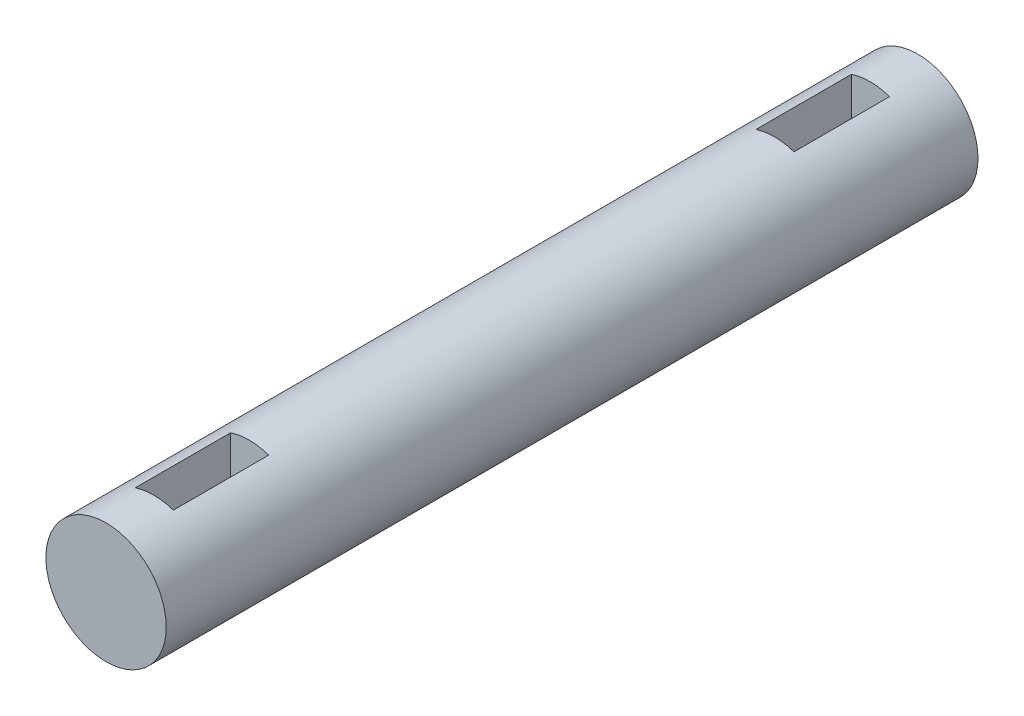
ISO-10303-21;
HEADER;
FILE_DESCRIPTION(('STEP AP214'),'2;1');
FILE_NAME('part.step','',(''),(''),'','','');
FILE_SCHEMA(('AUTOMOTIVE_DESIGN { 1 0 10303 214 1 1 1 1 }'));
ENDSEC;
DATA;
#1=APPLICATION_CONTEXT('core data for automotive mechanical design processes');
#2=APPLICATION_PROTOCOL_DEFINITION('international standard','automotive_design',2000,#1);
#3=PRODUCT_CONTEXT('',#1,'mechanical');
#4=PRODUCT('Part','Part','',(#3));
#5=PRODUCT_RELATED_PRODUCT_CATEGORY('part','',(#4));
#6=PRODUCT_DEFINITION_FORMATION('','',#4);
#7=PRODUCT_DEFINITION_CONTEXT('part definition',#1,'design');
#8=PRODUCT_DEFINITION('design','',#6,#7);
#9=PRODUCT_DEFINITION_SHAPE('','',#8);
#10=(LENGTH_UNIT() NAMED_UNIT(*) SI_UNIT(.MILLI.,.METRE.));
#11=(NAMED_UNIT(*) PLANE_ANGLE_UNIT() SI_UNIT($,.RADIAN.));
#12=(NAMED_UNIT(*) SI_UNIT($,.STERADIAN.) SOLID_ANGLE_UNIT());
#13=UNCERTAINTY_MEASURE_WITH_UNIT(LENGTH_MEASURE(1.E-05),#10,'distance_accuracy_value','');
#14=(GEOMETRIC_REPRESENTATION_CONTEXT(3) GLOBAL_UNCERTAINTY_ASSIGNED_CONTEXT((#13)) GLOBAL_UNIT_ASSIGNED_CONTEXT((#10,
#11,#12)) REPRESENTATION_CONTEXT('',''));
#15=CARTESIAN_POINT('',(0.,0.,0.));
#16=DIRECTION('',(0.,0.,1.));
#17=DIRECTION('',(1.,0.,0.));
#18=AXIS2_PLACEMENT_3D('',#15,#16,#17);
#19=CARTESIAN_POINT('',(0.,0.,-5.));
#20=DIRECTION('',(0.,0.,1.));
#21=DIRECTION('',(1.,0.,0.));
#22=AXIS2_PLACEMENT_3D('',#19,#20,#21);
#23=CYLINDRICAL_SURFACE('',#22,6.3);
#24=CARTESIAN_POINT('',(0.,0.,74.9918981065505));
#25=DIRECTION('',(0.,0.,1.));
#26=DIRECTION('',(1.,0.,0.));
#27=AXIS2_PLACEMENT_3D('',#24,#25,#26);
#28=CIRCLE('',#27,6.3);
#29=CARTESIAN_POINT('',(-1.95516009173228,5.98893554946932,74.9918981065505));
#30=VERTEX_POINT('',#29);
#31=CARTESIAN_POINT('',(2.03835839350811,5.96113202836635,74.9918981065505));
#32=VERTEX_POINT('',#31);
#33=EDGE_CURVE('E11',#30,#32,#28,.F.);
#34=ORIENTED_EDGE('',*,*,#33,.F.);
#35=DIRECTION('',(0.,0.,1.));
#36=VECTOR('',#35,1.);
#37=CARTESIAN_POINT('',(-1.95516009173228,5.98893554946932,-5.));
#38=LINE('',#37,#36);
#39=CARTESIAN_POINT('',(-1.95516009173228,5.98893554946932,65.0081018934496));
#40=VERTEX_POINT('',#39);
#41=EDGE_CURVE('E188',#40,#30,#38,.T.);
#42=ORIENTED_EDGE('',*,*,#41,.F.);
#43=CARTESIAN_POINT('',(0.,0.,65.0081018934496));
#44=DIRECTION('',(0.,0.,-1.));
#45=DIRECTION('',(-1.,0.,0.));
#46=AXIS2_PLACEMENT_3D('',#43,#44,#45);
#47=CIRCLE('',#46,6.3);
#48=CARTESIAN_POINT('',(2.03835839350811,5.96113202836635,65.0081018934496));
#49=VERTEX_POINT('',#48);
#50=EDGE_CURVE('E107',#49,#40,#47,.F.);
#51=ORIENTED_EDGE('',*,*,#50,.F.);
#52=DIRECTION('',(0.,0.,1.));
#53=VECTOR('',#52,1.);
#54=CARTESIAN_POINT('',(2.0383583935081,5.96113202836635,-5.));
#55=LINE('',#54,#53);
#56=EDGE_CURVE('E47',#32,#49,#55,.F.);
#57=ORIENTED_EDGE('',*,*,#56,.F.);
#58=EDGE_LOOP('',(#34,#42,#51,#57));
#59=FACE_BOUND('',#58,.T.);
#60=CARTESIAN_POINT('',(0.,0.,-5.));
#61=DIRECTION('',(0.,0.,1.));
#62=DIRECTION('',(1.,0.,0.));
#63=AXIS2_PLACEMENT_3D('',#60,#61,#62);
#64=CIRCLE('',#63,6.3);
#65=CARTESIAN_POINT('',(6.3,0.,-5.));
#66=VERTEX_POINT('',#65);
#67=EDGE_CURVE('E171',#66,#66,#64,.T.);
#68=ORIENTED_EDGE('',*,*,#67,.T.);
#69=EDGE_LOOP('',(#68));
#70=FACE_BOUND('',#69,.T.);
#71=CARTESIAN_POINT('',(0.,0.,80.));
#72=DIRECTION('',(0.,0.,1.));
#73=DIRECTION('',(1.,0.,0.));
#74=AXIS2_PLACEMENT_3D('',#71,#72,#73);
#75=CIRCLE('',#74,6.3);
#76=CARTESIAN_POINT('',(6.3,0.,80.));
#77=VERTEX_POINT('',#76);
#78=EDGE_CURVE('E141',#77,#77,#75,.T.);
#79=ORIENTED_EDGE('',*,*,#78,.F.);
#80=EDGE_LOOP('',(#79));
#81=FACE_BOUND('',#80,.T.);
#82=CARTESIAN_POINT('',(0.,0.,10.));
#83=DIRECTION('',(0.,0.,1.));
#84=DIRECTION('',(1.,0.,0.));
#85=AXIS2_PLACEMENT_3D('',#82,#83,#84);
#86=CIRCLE('',#85,6.3);
#87=CARTESIAN_POINT('',(-1.95516009173228,5.98893554946932,10.));
#88=VERTEX_POINT('',#87);
#89=CARTESIAN_POINT('',(2.03835839350811,5.96113202836635,10.));
#90=VERTEX_POINT('',#89);
#91=EDGE_CURVE('E181',#88,#90,#86,.F.);
#92=ORIENTED_EDGE('',*,*,#91,.F.);
#93=DIRECTION('',(0.,0.,1.));
#94=VECTOR('',#93,1.);
#95=CARTESIAN_POINT('',(-1.95516009173228,5.98893554946932,-5.));
#96=LINE('',#95,#94);
#97=CARTESIAN_POINT('',(-1.95516009173228,5.98893554946932,0.));
#98=VERTEX_POINT('',#97);
#99=EDGE_CURVE('E184',#88,#98,#96,.F.);
#100=ORIENTED_EDGE('',*,*,#99,.T.);
#101=CARTESIAN_POINT('',(0.,0.,0.));
#102=DIRECTION('',(0.,0.,-1.));
#103=DIRECTION('',(-1.,0.,0.));
#104=AXIS2_PLACEMENT_3D('',#101,#102,#103);
#105=CIRCLE('',#104,6.3);
#106=CARTESIAN_POINT('',(2.03835839350811,5.96113202836635,0.));
#107=VERTEX_POINT('',#106);
#108=EDGE_CURVE('E175',#107,#98,#105,.F.);
#109=ORIENTED_EDGE('',*,*,#108,.F.);
#110=DIRECTION('',(0.,0.,1.));
#111=VECTOR('',#110,1.);
#112=CARTESIAN_POINT('',(2.0383583935081,5.96113202836635,-5.));
#113=LINE('',#112,#111);
#114=EDGE_CURVE('E178',#90,#107,#113,.F.);
#115=ORIENTED_EDGE('',*,*,#114,.F.);
#116=EDGE_LOOP('',(#92,#100,#109,#115));
#117=FACE_BOUND('',#116,.T.);
#118=ADVANCED_FACE('F39',(#59,#70,#81,#117),#23,.T.);
#119=CARTESIAN_POINT('',(0.,0.,-5.));
#120=DIRECTION('',(0.,0.,1.));
#121=DIRECTION('',(1.,0.,0.));
#122=AXIS2_PLACEMENT_3D('',#119,#120,#121);
#123=PLANE('',#122);
#124=ORIENTED_EDGE('',*,*,#67,.F.);
#125=EDGE_LOOP('',(#124));
#126=FACE_BOUND('',#125,.T.);
#127=ADVANCED_FACE('F215',(#126),#123,.F.);
#128=CARTESIAN_POINT('',(0.,0.,80.));
#129=DIRECTION('',(0.,0.,1.));
#130=DIRECTION('',(1.,0.,0.));
#131=AXIS2_PLACEMENT_3D('',#128,#129,#130);
#132=PLANE('',#131);
#133=ORIENTED_EDGE('',*,*,#78,.T.);
#134=EDGE_LOOP('',(#133));
#135=FACE_BOUND('',#134,.T.);
#136=ADVANCED_FACE('F219',(#135),#132,.T.);
#137=CARTESIAN_POINT('',(-1.95516009173228,10.,0.));
#138=DIRECTION('',(1.,0.,0.));
#139=DIRECTION('',(0.,0.,-1.));
#140=AXIS2_PLACEMENT_3D('',#137,#138,#139);
#141=PLANE('',#140);
#142=DIRECTION('',(0.,-1.,0.));
#143=VECTOR('',#142,1.);
#144=CARTESIAN_POINT('',(-1.95516009173228,10.,10.));
#145=LINE('',#144,#143);
#146=CARTESIAN_POINT('',(-1.95516009173228,0.,10.));
#147=VERTEX_POINT('',#146);
#148=EDGE_CURVE('E150',#88,#147,#145,.T.);
#149=ORIENTED_EDGE('',*,*,#148,.T.);
#150=DIRECTION('',(0.,0.,1.));
#151=VECTOR('',#150,1.);
#152=CARTESIAN_POINT('',(-1.95516009173228,0.,0.));
#153=LINE('',#152,#151);
#154=CARTESIAN_POINT('',(-1.95516009173228,0.,0.));
#155=VERTEX_POINT('',#154);
#156=EDGE_CURVE('E128',#155,#147,#153,.T.);
#157=ORIENTED_EDGE('',*,*,#156,.F.);
#158=DIRECTION('',(0.,-1.,0.));
#159=VECTOR('',#158,1.);
#160=CARTESIAN_POINT('',(-1.95516009173228,10.,0.));
#161=LINE('',#160,#159);
#162=EDGE_CURVE('E147',#98,#155,#161,.T.);
#163=ORIENTED_EDGE('',*,*,#162,.F.);
#164=ORIENTED_EDGE('',*,*,#99,.F.);
#165=EDGE_LOOP('',(#149,#157,#163,#164));
#166=FACE_BOUND('',#165,.T.);
#167=ADVANCED_FACE('F224',(#166),#141,.T.);
#168=CARTESIAN_POINT('',(2.03835839350811,10.,10.));
#169=DIRECTION('',(0.,0.,1.));
#170=DIRECTION('',(1.,0.,0.));
#171=AXIS2_PLACEMENT_3D('',#168,#169,#170);
#172=PLANE('',#171);
#173=ORIENTED_EDGE('',*,*,#91,.T.);
#174=DIRECTION('',(0.,-1.,0.));
#175=VECTOR('',#174,1.);
#176=CARTESIAN_POINT('',(2.03835839350811,10.,10.));
#177=LINE('',#176,#175);
#178=CARTESIAN_POINT('',(2.03835839350811,0.,10.));
#179=VERTEX_POINT('',#178);
#180=EDGE_CURVE('E153',#90,#179,#177,.T.);
#181=ORIENTED_EDGE('',*,*,#180,.T.);
#182=DIRECTION('',(-1.,0.,0.));
#183=VECTOR('',#182,1.);
#184=CARTESIAN_POINT('',(2.03835839350811,0.,10.));
#185=LINE('',#184,#183);
#186=EDGE_CURVE('E132',#179,#147,#185,.T.);
#187=ORIENTED_EDGE('',*,*,#186,.T.);
#188=ORIENTED_EDGE('',*,*,#148,.F.);
#189=EDGE_LOOP('',(#173,#181,#187,#188));
#190=FACE_BOUND('',#189,.T.);
#191=ADVANCED_FACE('F234',(#190),#172,.F.);
#192=CARTESIAN_POINT('',(2.03835839350811,10.,0.));
#193=DIRECTION('',(1.,0.,0.));
#194=DIRECTION('',(0.,0.,-1.));
#195=AXIS2_PLACEMENT_3D('',#192,#193,#194);
#196=PLANE('',#195);
#197=ORIENTED_EDGE('',*,*,#114,.T.);
#198=DIRECTION('',(0.,-1.,0.));
#199=VECTOR('',#198,1.);
#200=CARTESIAN_POINT('',(2.03835839350811,10.,0.));
#201=LINE('',#200,#199);
#202=CARTESIAN_POINT('',(2.03835839350811,0.,0.));
#203=VERTEX_POINT('',#202);
#204=EDGE_CURVE('E62',#107,#203,#201,.T.);
#205=ORIENTED_EDGE('',*,*,#204,.T.);
#206=DIRECTION('',(0.,0.,1.));
#207=VECTOR('',#206,1.);
#208=CARTESIAN_POINT('',(2.03835839350811,0.,0.));
#209=LINE('',#208,#207);
#210=EDGE_CURVE('E161',#203,#179,#209,.T.);
#211=ORIENTED_EDGE('',*,*,#210,.T.);
#212=ORIENTED_EDGE('',*,*,#180,.F.);
#213=EDGE_LOOP('',(#197,#205,#211,#212));
#214=FACE_BOUND('',#213,.T.);
#215=ADVANCED_FACE('F231',(#214),#196,.F.);
#216=CARTESIAN_POINT('',(0.,10.,0.));
#217=DIRECTION('',(0.,0.,-1.));
#218=DIRECTION('',(-1.,0.,0.));
#219=AXIS2_PLACEMENT_3D('',#216,#217,#218);
#220=PLANE('',#219);
#221=ORIENTED_EDGE('',*,*,#108,.T.);
#222=ORIENTED_EDGE('',*,*,#162,.T.);
#223=DIRECTION('',(1.,0.,0.));
#224=VECTOR('',#223,1.);
#225=CARTESIAN_POINT('',(0.,0.,0.));
#226=LINE('',#225,#224);
#227=EDGE_CURVE('E158',#155,#203,#226,.T.);
#228=ORIENTED_EDGE('',*,*,#227,.T.);
#229=ORIENTED_EDGE('',*,*,#204,.F.);
#230=EDGE_LOOP('',(#221,#222,#228,#229));
#231=FACE_BOUND('',#230,.T.);
#232=ADVANCED_FACE('F210',(#231),#220,.F.);
#233=CARTESIAN_POINT('',(0.,0.,0.));
#234=DIRECTION('',(0.,1.,0.));
#235=DIRECTION('',(0.,0.,1.));
#236=AXIS2_PLACEMENT_3D('',#233,#234,#235);
#237=PLANE('',#236);
#238=ORIENTED_EDGE('',*,*,#156,.T.);
#239=ORIENTED_EDGE('',*,*,#186,.F.);
#240=ORIENTED_EDGE('',*,*,#210,.F.);
#241=ORIENTED_EDGE('',*,*,#227,.F.);
#242=EDGE_LOOP('',(#238,#239,#240,#241));
#243=FACE_BOUND('',#242,.T.);
#244=ADVANCED_FACE('F203',(#243),#237,.T.);
#245=CARTESIAN_POINT('',(2.03835839350811,10.,74.9918981065505));
#246=DIRECTION('',(0.,0.,1.));
#247=DIRECTION('',(1.,0.,0.));
#248=AXIS2_PLACEMENT_3D('',#245,#246,#247);
#249=PLANE('',#248);
#250=ORIENTED_EDGE('',*,*,#33,.T.);
#251=DIRECTION('',(0.,-1.,0.));
#252=VECTOR('',#251,1.);
#253=CARTESIAN_POINT('',(2.03835839350811,10.,74.9918981065505));
#254=LINE('',#253,#252);
#255=CARTESIAN_POINT('',(2.03835839350811,0.,74.9918981065505));
#256=VERTEX_POINT('',#255);
#257=EDGE_CURVE('E142',#32,#256,#254,.T.);
#258=ORIENTED_EDGE('',*,*,#257,.T.);
#259=DIRECTION('',(-1.,0.,0.));
#260=VECTOR('',#259,1.);
#261=CARTESIAN_POINT('',(2.03835839350811,0.,74.9918981065505));
#262=LINE('',#261,#260);
#263=CARTESIAN_POINT('',(-1.95516009173228,0.,74.9918981065505));
#264=VERTEX_POINT('',#263);
#265=EDGE_CURVE('E111',#256,#264,#262,.T.);
#266=ORIENTED_EDGE('',*,*,#265,.T.);
#267=DIRECTION('',(0.,-1.,0.));
#268=VECTOR('',#267,1.);
#269=CARTESIAN_POINT('',(-1.95516009173228,10.,74.9918981065505));
#270=LINE('',#269,#268);
#271=EDGE_CURVE('E126',#30,#264,#270,.T.);
#272=ORIENTED_EDGE('',*,*,#271,.F.);
#273=EDGE_LOOP('',(#250,#258,#266,#272));
#274=FACE_BOUND('',#273,.T.);
#275=ADVANCED_FACE('F201',(#274),#249,.F.);
#276=CARTESIAN_POINT('',(2.03835839350811,10.,65.0081018934496));
#277=DIRECTION('',(1.,0.,0.));
#278=DIRECTION('',(0.,0.,-1.));
#279=AXIS2_PLACEMENT_3D('',#276,#277,#278);
#280=PLANE('',#279);
#281=ORIENTED_EDGE('',*,*,#56,.T.);
#282=DIRECTION('',(0.,-1.,0.));
#283=VECTOR('',#282,1.);
#284=CARTESIAN_POINT('',(2.03835839350811,10.,65.0081018934496));
#285=LINE('',#284,#283);
#286=CARTESIAN_POINT('',(2.03835839350811,0.,65.0081018934496));
#287=VERTEX_POINT('',#286);
#288=EDGE_CURVE('E110',#49,#287,#285,.T.);
#289=ORIENTED_EDGE('',*,*,#288,.T.);
#290=DIRECTION('',(0.,0.,1.));
#291=VECTOR('',#290,1.);
#292=CARTESIAN_POINT('',(2.03835839350811,0.,65.0081018934496));
#293=LINE('',#292,#291);
#294=EDGE_CURVE('E121',#287,#256,#293,.T.);
#295=ORIENTED_EDGE('',*,*,#294,.T.);
#296=ORIENTED_EDGE('',*,*,#257,.F.);
#297=EDGE_LOOP('',(#281,#289,#295,#296));
#298=FACE_BOUND('',#297,.T.);
#299=ADVANCED_FACE('F196',(#298),#280,.F.);
#300=CARTESIAN_POINT('',(0.,10.,65.0081018934496));
#301=DIRECTION('',(0.,0.,-1.));
#302=DIRECTION('',(-1.,0.,0.));
#303=AXIS2_PLACEMENT_3D('',#300,#301,#302);
#304=PLANE('',#303);
#305=ORIENTED_EDGE('',*,*,#50,.T.);
#306=DIRECTION('',(0.,-1.,0.));
#307=VECTOR('',#306,1.);
#308=CARTESIAN_POINT('',(-1.95516009173228,10.,65.0081018934496));
#309=LINE('',#308,#307);
#310=CARTESIAN_POINT('',(-1.95516009173228,0.,65.0081018934496));
#311=VERTEX_POINT('',#310);
#312=EDGE_CURVE('E54',#40,#311,#309,.T.);
#313=ORIENTED_EDGE('',*,*,#312,.T.);
#314=DIRECTION('',(1.,0.,0.));
#315=VECTOR('',#314,1.);
#316=CARTESIAN_POINT('',(0.,0.,65.0081018934496));
#317=LINE('',#316,#315);
#318=EDGE_CURVE('E105',#311,#287,#317,.T.);
#319=ORIENTED_EDGE('',*,*,#318,.T.);
#320=ORIENTED_EDGE('',*,*,#288,.F.);
#321=EDGE_LOOP('',(#305,#313,#319,#320));
#322=FACE_BOUND('',#321,.T.);
#323=ADVANCED_FACE('F103',(#322),#304,.F.);
#324=CARTESIAN_POINT('',(-1.95516009173228,10.,70.));
#325=DIRECTION('',(-1.,0.,0.));
#326=DIRECTION('',(0.,0.,1.));
#327=AXIS2_PLACEMENT_3D('',#324,#325,#326);
#328=PLANE('',#327);
#329=ORIENTED_EDGE('',*,*,#41,.T.);
#330=ORIENTED_EDGE('',*,*,#271,.T.);
#331=DIRECTION('',(0.,0.,-1.));
#332=VECTOR('',#331,1.);
#333=CARTESIAN_POINT('',(-1.95516009173228,0.,70.));
#334=LINE('',#333,#332);
#335=EDGE_CURVE('E118',#264,#311,#334,.T.);
#336=ORIENTED_EDGE('',*,*,#335,.T.);
#337=ORIENTED_EDGE('',*,*,#312,.F.);
#338=EDGE_LOOP('',(#329,#330,#336,#337));
#339=FACE_BOUND('',#338,.T.);
#340=ADVANCED_FACE('F124',(#339),#328,.F.);
#341=CARTESIAN_POINT('',(0.,0.,0.));
#342=DIRECTION('',(0.,-1.,0.));
#343=DIRECTION('',(0.,0.,-1.));
#344=AXIS2_PLACEMENT_3D('',#341,#342,#343);
#345=PLANE('',#344);
#346=ORIENTED_EDGE('',*,*,#265,.F.);
#347=ORIENTED_EDGE('',*,*,#294,.F.);
#348=ORIENTED_EDGE('',*,*,#318,.F.);
#349=ORIENTED_EDGE('',*,*,#335,.F.);
#350=EDGE_LOOP('',(#346,#347,#348,#349));
#351=FACE_BOUND('',#350,.T.);
#352=ADVANCED_FACE('F117',(#351),#345,.F.);
#353=CLOSED_SHELL('',(#118,#127,#136,#167,#191,#215,#232,#244,#275,#299,#323,#340,#352));
#354=MANIFOLD_SOLID_BREP('B2',#353);
#355=ADVANCED_BREP_SHAPE_REPRESENTATION('',(#18,#354),#14);
#356=SHAPE_DEFINITION_REPRESENTATION(#9,#355);
ENDSEC;
END-ISO-10303-21;
